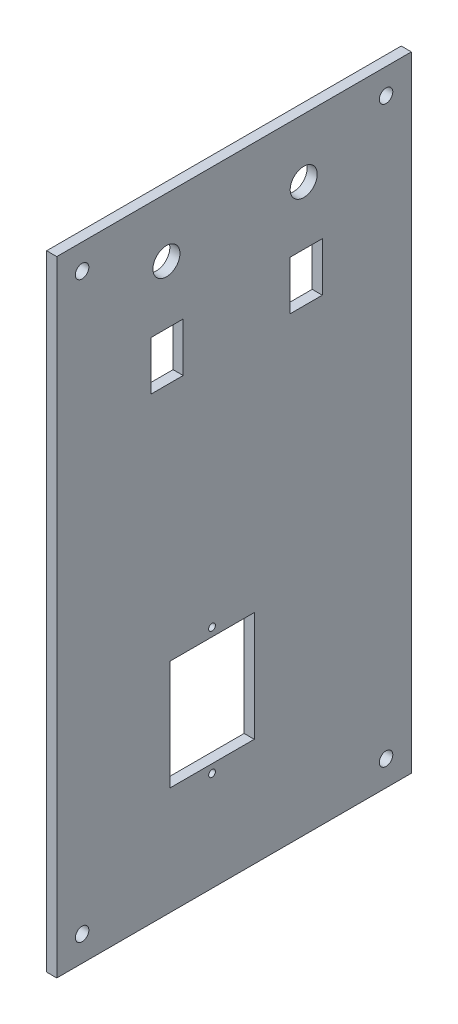
ISO-10303-21;
HEADER;
FILE_DESCRIPTION(('STEP AP214'),'2;1');
FILE_NAME('part.step','',(''),(''),'','','');
FILE_SCHEMA(('AUTOMOTIVE_DESIGN { 1 0 10303 214 1 1 1 1 }'));
ENDSEC;
DATA;
#1=APPLICATION_CONTEXT('core data for automotive mechanical design processes');
#2=APPLICATION_PROTOCOL_DEFINITION('international standard','automotive_design',2000,#1);
#3=PRODUCT_CONTEXT('',#1,'mechanical');
#4=PRODUCT('Part','Part','',(#3));
#5=PRODUCT_RELATED_PRODUCT_CATEGORY('part','',(#4));
#6=PRODUCT_DEFINITION_FORMATION('','',#4);
#7=PRODUCT_DEFINITION_CONTEXT('part definition',#1,'design');
#8=PRODUCT_DEFINITION('design','',#6,#7);
#9=PRODUCT_DEFINITION_SHAPE('','',#8);
#10=(LENGTH_UNIT() NAMED_UNIT(*) SI_UNIT(.MILLI.,.METRE.));
#11=(NAMED_UNIT(*) PLANE_ANGLE_UNIT() SI_UNIT($,.RADIAN.));
#12=(NAMED_UNIT(*) SI_UNIT($,.STERADIAN.) SOLID_ANGLE_UNIT());
#13=UNCERTAINTY_MEASURE_WITH_UNIT(LENGTH_MEASURE(1.E-05),#10,'distance_accuracy_value','');
#14=(GEOMETRIC_REPRESENTATION_CONTEXT(3) GLOBAL_UNCERTAINTY_ASSIGNED_CONTEXT((#13)) GLOBAL_UNIT_ASSIGNED_CONTEXT((#10,
#11,#12)) REPRESENTATION_CONTEXT('',''));
#15=CARTESIAN_POINT('',(0.,0.,0.));
#16=DIRECTION('',(0.,0.,1.));
#17=DIRECTION('',(1.,0.,0.));
#18=AXIS2_PLACEMENT_3D('',#15,#16,#17);
#19=CARTESIAN_POINT('',(6.,0.,0.));
#20=DIRECTION('',(0.,0.,-1.));
#21=DIRECTION('',(-1.,0.,0.));
#22=AXIS2_PLACEMENT_3D('',#19,#20,#21);
#23=PLANE('',#22);
#24=DIRECTION('',(0.,-1.,0.));
#25=VECTOR('',#24,1.);
#26=CARTESIAN_POINT('',(0.,0.,0.));
#27=LINE('',#26,#25);
#28=CARTESIAN_POINT('',(0.,370.,0.));
#29=VERTEX_POINT('',#28);
#30=CARTESIAN_POINT('',(0.,0.,0.));
#31=VERTEX_POINT('',#30);
#32=EDGE_CURVE('E249',#29,#31,#27,.T.);
#33=ORIENTED_EDGE('',*,*,#32,.T.);
#34=DIRECTION('',(-1.,0.,0.));
#35=VECTOR('',#34,1.);
#36=CARTESIAN_POINT('',(6.,0.,0.));
#37=LINE('',#36,#35);
#38=CARTESIAN_POINT('',(6.,0.,0.));
#39=VERTEX_POINT('',#38);
#40=EDGE_CURVE('E11',#39,#31,#37,.T.);
#41=ORIENTED_EDGE('',*,*,#40,.F.);
#42=DIRECTION('',(0.,-1.,0.));
#43=VECTOR('',#42,1.);
#44=CARTESIAN_POINT('',(6.,0.,0.));
#45=LINE('',#44,#43);
#46=CARTESIAN_POINT('',(6.,370.,0.));
#47=VERTEX_POINT('',#46);
#48=EDGE_CURVE('E250',#47,#39,#45,.T.);
#49=ORIENTED_EDGE('',*,*,#48,.F.);
#50=DIRECTION('',(-1.,0.,0.));
#51=VECTOR('',#50,1.);
#52=CARTESIAN_POINT('',(6.,370.,0.));
#53=LINE('',#52,#51);
#54=EDGE_CURVE('E260',#47,#29,#53,.T.);
#55=ORIENTED_EDGE('',*,*,#54,.T.);
#56=EDGE_LOOP('',(#33,#41,#49,#55));
#57=FACE_BOUND('',#56,.T.);
#58=ADVANCED_FACE('F32',(#57),#23,.F.);
#59=CARTESIAN_POINT('',(6.,0.,0.));
#60=DIRECTION('',(0.,1.,0.));
#61=DIRECTION('',(0.,0.,1.));
#62=AXIS2_PLACEMENT_3D('',#59,#60,#61);
#63=PLANE('',#62);
#64=DIRECTION('',(0.,0.,-1.));
#65=VECTOR('',#64,1.);
#66=CARTESIAN_POINT('',(0.,0.,0.));
#67=LINE('',#66,#65);
#68=CARTESIAN_POINT('',(0.,0.,-210.));
#69=VERTEX_POINT('',#68);
#70=EDGE_CURVE('E263',#31,#69,#67,.T.);
#71=ORIENTED_EDGE('',*,*,#70,.T.);
#72=DIRECTION('',(-1.,0.,0.));
#73=VECTOR('',#72,1.);
#74=CARTESIAN_POINT('',(6.,0.,-210.));
#75=LINE('',#74,#73);
#76=CARTESIAN_POINT('',(6.,0.,-210.));
#77=VERTEX_POINT('',#76);
#78=EDGE_CURVE('E40',#77,#69,#75,.T.);
#79=ORIENTED_EDGE('',*,*,#78,.F.);
#80=DIRECTION('',(0.,0.,-1.));
#81=VECTOR('',#80,1.);
#82=CARTESIAN_POINT('',(6.,0.,0.));
#83=LINE('',#82,#81);
#84=EDGE_CURVE('E253',#39,#77,#83,.T.);
#85=ORIENTED_EDGE('',*,*,#84,.F.);
#86=ORIENTED_EDGE('',*,*,#40,.T.);
#87=EDGE_LOOP('',(#71,#79,#85,#86));
#88=FACE_BOUND('',#87,.T.);
#89=ADVANCED_FACE('F341',(#88),#63,.F.);
#90=CARTESIAN_POINT('',(6.,0.,-210.));
#91=DIRECTION('',(0.,0.,1.));
#92=DIRECTION('',(1.,0.,0.));
#93=AXIS2_PLACEMENT_3D('',#90,#91,#92);
#94=PLANE('',#93);
#95=DIRECTION('',(0.,1.,0.));
#96=VECTOR('',#95,1.);
#97=CARTESIAN_POINT('',(0.,0.,-210.));
#98=LINE('',#97,#96);
#99=CARTESIAN_POINT('',(0.,370.,-210.));
#100=VERTEX_POINT('',#99);
#101=EDGE_CURVE('E265',#69,#100,#98,.T.);
#102=ORIENTED_EDGE('',*,*,#101,.T.);
#103=DIRECTION('',(-1.,0.,0.));
#104=VECTOR('',#103,1.);
#105=CARTESIAN_POINT('',(6.,370.,-210.));
#106=LINE('',#105,#104);
#107=CARTESIAN_POINT('',(6.,370.,-210.));
#108=VERTEX_POINT('',#107);
#109=EDGE_CURVE('E270',#108,#100,#106,.T.);
#110=ORIENTED_EDGE('',*,*,#109,.F.);
#111=DIRECTION('',(0.,1.,0.));
#112=VECTOR('',#111,1.);
#113=CARTESIAN_POINT('',(6.,0.,-210.));
#114=LINE('',#113,#112);
#115=EDGE_CURVE('E256',#77,#108,#114,.T.);
#116=ORIENTED_EDGE('',*,*,#115,.F.);
#117=ORIENTED_EDGE('',*,*,#78,.T.);
#118=EDGE_LOOP('',(#102,#110,#116,#117));
#119=FACE_BOUND('',#118,.T.);
#120=ADVANCED_FACE('F346',(#119),#94,.F.);
#121=CARTESIAN_POINT('',(6.,370.,0.));
#122=DIRECTION('',(0.,-1.,0.));
#123=DIRECTION('',(0.,0.,-1.));
#124=AXIS2_PLACEMENT_3D('',#121,#122,#123);
#125=PLANE('',#124);
#126=DIRECTION('',(0.,0.,1.));
#127=VECTOR('',#126,1.);
#128=CARTESIAN_POINT('',(0.,370.,0.));
#129=LINE('',#128,#127);
#130=EDGE_CURVE('E254',#100,#29,#129,.T.);
#131=ORIENTED_EDGE('',*,*,#130,.T.);
#132=ORIENTED_EDGE('',*,*,#54,.F.);
#133=DIRECTION('',(0.,0.,1.));
#134=VECTOR('',#133,1.);
#135=CARTESIAN_POINT('',(6.,370.,0.));
#136=LINE('',#135,#134);
#137=EDGE_CURVE('E258',#108,#47,#136,.T.);
#138=ORIENTED_EDGE('',*,*,#137,.F.);
#139=ORIENTED_EDGE('',*,*,#109,.T.);
#140=EDGE_LOOP('',(#131,#132,#138,#139));
#141=FACE_BOUND('',#140,.T.);
#142=ADVANCED_FACE('F328',(#141),#125,.F.);
#143=CARTESIAN_POINT('',(6.,0.,0.));
#144=DIRECTION('',(-1.,0.,0.));
#145=DIRECTION('',(0.,0.,1.));
#146=AXIS2_PLACEMENT_3D('',#143,#144,#145);
#147=PLANE('',#146);
#148=CARTESIAN_POINT('',(6.,355.052871545296,-15.0000931800799));
#149=DIRECTION('',(1.,0.,0.));
#150=DIRECTION('',(0.,0.,-1.));
#151=AXIS2_PLACEMENT_3D('',#148,#149,#150);
#152=CIRCLE('',#151,4.);
#153=CARTESIAN_POINT('',(6.,355.052871545296,-19.0000931800799));
#154=VERTEX_POINT('',#153);
#155=EDGE_CURVE('E291',#154,#154,#152,.T.);
#156=ORIENTED_EDGE('',*,*,#155,.F.);
#157=EDGE_LOOP('',(#156));
#158=FACE_BOUND('',#157,.T.);
#159=CARTESIAN_POINT('',(6.,354.999999999996,-195.000046590044));
#160=DIRECTION('',(1.,0.,0.));
#161=DIRECTION('',(0.,0.,-1.));
#162=AXIS2_PLACEMENT_3D('',#159,#160,#161);
#163=CIRCLE('',#162,3.99999999999999);
#164=CARTESIAN_POINT('',(6.,354.999999999996,-199.000046590044));
#165=VERTEX_POINT('',#164);
#166=EDGE_CURVE('E574',#165,#165,#163,.T.);
#167=ORIENTED_EDGE('',*,*,#166,.F.);
#168=EDGE_LOOP('',(#167));
#169=FACE_BOUND('',#168,.T.);
#170=CARTESIAN_POINT('',(6.,15.0176394205886,-195.000000000008));
#171=DIRECTION('',(1.,0.,0.));
#172=DIRECTION('',(0.,0.,-1.));
#173=AXIS2_PLACEMENT_3D('',#170,#171,#172);
#174=CIRCLE('',#173,3.99999999999999);
#175=CARTESIAN_POINT('',(6.,15.0176394205886,-199.000000000008));
#176=VERTEX_POINT('',#175);
#177=EDGE_CURVE('E304',#176,#176,#174,.T.);
#178=ORIENTED_EDGE('',*,*,#177,.F.);
#179=EDGE_LOOP('',(#178));
#180=FACE_BOUND('',#179,.T.);
#181=CARTESIAN_POINT('',(6.,15.1057430905918,-15.0000465900471));
#182=DIRECTION('',(1.,0.,0.));
#183=DIRECTION('',(0.,0.,-1.));
#184=AXIS2_PLACEMENT_3D('',#181,#182,#183);
#185=CIRCLE('',#184,4.);
#186=CARTESIAN_POINT('',(6.,15.1057430905918,-19.0000465900471));
#187=VERTEX_POINT('',#186);
#188=EDGE_CURVE('E287',#187,#187,#185,.T.);
#189=ORIENTED_EDGE('',*,*,#188,.F.);
#190=EDGE_LOOP('',(#189));
#191=FACE_BOUND('',#190,.T.);
#192=CARTESIAN_POINT('',(6.,335.160418708699,-64.9568234236906));
#193=DIRECTION('',(1.,0.,0.));
#194=DIRECTION('',(0.,0.,-1.));
#195=AXIS2_PLACEMENT_3D('',#192,#193,#194);
#196=CIRCLE('',#195,8.00000000002815);
#197=CARTESIAN_POINT('',(6.,335.160418708699,-72.9568234237188));
#198=VERTEX_POINT('',#197);
#199=EDGE_CURVE('E283',#198,#198,#196,.T.);
#200=ORIENTED_EDGE('',*,*,#199,.F.);
#201=EDGE_LOOP('',(#200));
#202=FACE_BOUND('',#201,.T.);
#203=CARTESIAN_POINT('',(6.,335.160418708701,-146.241614861531));
#204=DIRECTION('',(1.,0.,0.));
#205=DIRECTION('',(0.,0.,-1.));
#206=AXIS2_PLACEMENT_3D('',#203,#204,#205);
#207=CIRCLE('',#206,7.99999999999956);
#208=CARTESIAN_POINT('',(6.,335.160418708701,-154.24161486153));
#209=VERTEX_POINT('',#208);
#210=EDGE_CURVE('E279',#209,#209,#207,.T.);
#211=ORIENTED_EDGE('',*,*,#210,.F.);
#212=EDGE_LOOP('',(#211));
#213=FACE_BOUND('',#212,.T.);
#214=CARTESIAN_POINT('',(6.,58.9516158060169,-91.9554394391757));
#215=DIRECTION('',(-1.,0.,0.));
#216=DIRECTION('',(0.,0.,1.));
#217=AXIS2_PLACEMENT_3D('',#214,#215,#216);
#218=CIRCLE('',#217,1.99999999999186);
#219=CARTESIAN_POINT('',(6.,58.9516158060169,-89.9554394391839));
#220=VERTEX_POINT('',#219);
#221=EDGE_CURVE('E312',#220,#220,#218,.T.);
#222=ORIENTED_EDGE('',*,*,#221,.T.);
#223=EDGE_LOOP('',(#222));
#224=FACE_BOUND('',#223,.T.);
#225=CARTESIAN_POINT('',(6.,133.951615806017,-91.955439439176));
#226=DIRECTION('',(-1.,0.,0.));
#227=DIRECTION('',(0.,0.,1.));
#228=AXIS2_PLACEMENT_3D('',#225,#226,#227);
#229=CIRCLE('',#228,1.99999999999186);
#230=CARTESIAN_POINT('',(6.,133.951615806017,-89.9554394391841));
#231=VERTEX_POINT('',#230);
#232=EDGE_CURVE('E181',#231,#231,#229,.T.);
#233=ORIENTED_EDGE('',*,*,#232,.T.);
#234=EDGE_LOOP('',(#233));
#235=FACE_BOUND('',#234,.T.);
#236=DIRECTION('',(0.,0.,-1.));
#237=VECTOR('',#236,1.);
#238=CARTESIAN_POINT('',(6.,300.567321943193,0.));
#239=LINE('',#238,#237);
#240=CARTESIAN_POINT('',(6.,300.567321943193,-138.262028200826));
#241=VERTEX_POINT('',#240);
#242=CARTESIAN_POINT('',(6.,300.567321943193,-157.262028200826));
#243=VERTEX_POINT('',#242);
#244=EDGE_CURVE('E211',#241,#243,#239,.T.);
#245=ORIENTED_EDGE('',*,*,#244,.T.);
#246=DIRECTION('',(0.,-1.,0.));
#247=VECTOR('',#246,1.);
#248=CARTESIAN_POINT('',(6.,0.,-157.262028200826));
#249=LINE('',#248,#247);
#250=CARTESIAN_POINT('',(6.,271.567321943193,-157.262028200826));
#251=VERTEX_POINT('',#250);
#252=EDGE_CURVE('E214',#243,#251,#249,.T.);
#253=ORIENTED_EDGE('',*,*,#252,.T.);
#254=DIRECTION('',(0.,0.,1.));
#255=VECTOR('',#254,1.);
#256=CARTESIAN_POINT('',(6.,271.567321943193,0.));
#257=LINE('',#256,#255);
#258=CARTESIAN_POINT('',(6.,271.567321943193,-138.262028200826));
#259=VERTEX_POINT('',#258);
#260=EDGE_CURVE('E208',#251,#259,#257,.T.);
#261=ORIENTED_EDGE('',*,*,#260,.T.);
#262=DIRECTION('',(0.,1.,0.));
#263=VECTOR('',#262,1.);
#264=CARTESIAN_POINT('',(6.,0.,-138.262028200826));
#265=LINE('',#264,#263);
#266=EDGE_CURVE('E151',#259,#241,#265,.T.);
#267=ORIENTED_EDGE('',*,*,#266,.T.);
#268=EDGE_LOOP('',(#245,#253,#261,#267));
#269=FACE_BOUND('',#268,.T.);
#270=DIRECTION('',(0.,0.,-1.));
#271=VECTOR('',#270,1.);
#272=CARTESIAN_POINT('',(6.,300.567321943193,0.));
#273=LINE('',#272,#271);
#274=CARTESIAN_POINT('',(6.,300.567321943193,-55.8778644499005));
#275=VERTEX_POINT('',#274);
#276=CARTESIAN_POINT('',(6.,300.567321943193,-74.8778644499005));
#277=VERTEX_POINT('',#276);
#278=EDGE_CURVE('E202',#275,#277,#273,.T.);
#279=ORIENTED_EDGE('',*,*,#278,.T.);
#280=DIRECTION('',(0.,-1.,0.));
#281=VECTOR('',#280,1.);
#282=CARTESIAN_POINT('',(6.,0.,-74.8778644499005));
#283=LINE('',#282,#281);
#284=CARTESIAN_POINT('',(6.,271.567321943193,-74.8778644499005));
#285=VERTEX_POINT('',#284);
#286=EDGE_CURVE('E205',#277,#285,#283,.T.);
#287=ORIENTED_EDGE('',*,*,#286,.T.);
#288=DIRECTION('',(0.,0.,1.));
#289=VECTOR('',#288,1.);
#290=CARTESIAN_POINT('',(6.,271.567321943193,0.));
#291=LINE('',#290,#289);
#292=CARTESIAN_POINT('',(6.,271.567321943193,-55.8778644499005));
#293=VERTEX_POINT('',#292);
#294=EDGE_CURVE('E175',#285,#293,#291,.T.);
#295=ORIENTED_EDGE('',*,*,#294,.T.);
#296=DIRECTION('',(0.,1.,0.));
#297=VECTOR('',#296,1.);
#298=CARTESIAN_POINT('',(6.,0.,-55.8778644499005));
#299=LINE('',#298,#297);
#300=EDGE_CURVE('E199',#293,#275,#299,.T.);
#301=ORIENTED_EDGE('',*,*,#300,.T.);
#302=EDGE_LOOP('',(#279,#287,#295,#301));
#303=FACE_BOUND('',#302,.T.);
#304=DIRECTION('',(0.,0.,-1.));
#305=VECTOR('',#304,1.);
#306=CARTESIAN_POINT('',(6.,128.951615806017,0.));
#307=LINE('',#306,#305);
#308=CARTESIAN_POINT('',(6.,128.951615806017,-66.955439439176));
#309=VERTEX_POINT('',#308);
#310=CARTESIAN_POINT('',(6.,128.951615806017,-116.955439439176));
#311=VERTEX_POINT('',#310);
#312=EDGE_CURVE('E243',#309,#311,#307,.T.);
#313=ORIENTED_EDGE('',*,*,#312,.T.);
#314=DIRECTION('',(0.,-1.,0.));
#315=VECTOR('',#314,1.);
#316=CARTESIAN_POINT('',(6.,0.,-116.955439439176));
#317=LINE('',#316,#315);
#318=CARTESIAN_POINT('',(6.,63.9516158060169,-116.955439439176));
#319=VERTEX_POINT('',#318);
#320=EDGE_CURVE('E246',#311,#319,#317,.T.);
#321=ORIENTED_EDGE('',*,*,#320,.T.);
#322=DIRECTION('',(0.,0.,1.));
#323=VECTOR('',#322,1.);
#324=CARTESIAN_POINT('',(6.,63.9516158060169,0.));
#325=LINE('',#324,#323);
#326=CARTESIAN_POINT('',(6.,63.9516158060169,-66.955439439176));
#327=VERTEX_POINT('',#326);
#328=EDGE_CURVE('E231',#319,#327,#325,.T.);
#329=ORIENTED_EDGE('',*,*,#328,.T.);
#330=DIRECTION('',(0.,1.,0.));
#331=VECTOR('',#330,1.);
#332=CARTESIAN_POINT('',(6.,0.,-66.955439439176));
#333=LINE('',#332,#331);
#334=EDGE_CURVE('E240',#327,#309,#333,.T.);
#335=ORIENTED_EDGE('',*,*,#334,.T.);
#336=EDGE_LOOP('',(#313,#321,#329,#335));
#337=FACE_BOUND('',#336,.T.);
#338=ORIENTED_EDGE('',*,*,#48,.T.);
#339=ORIENTED_EDGE('',*,*,#84,.T.);
#340=ORIENTED_EDGE('',*,*,#115,.T.);
#341=ORIENTED_EDGE('',*,*,#137,.T.);
#342=EDGE_LOOP('',(#338,#339,#340,#341));
#343=FACE_BOUND('',#342,.T.);
#344=ADVANCED_FACE('F325',(#158,#169,#180,#191,#202,#213,#224,#235,#269,#303,#337,#343),#147,.F.);
#345=CARTESIAN_POINT('',(0.,0.,0.));
#346=DIRECTION('',(-1.,0.,0.));
#347=DIRECTION('',(0.,0.,1.));
#348=AXIS2_PLACEMENT_3D('',#345,#346,#347);
#349=PLANE('',#348);
#350=CARTESIAN_POINT('',(0.,355.052871545296,-15.0000931800799));
#351=DIRECTION('',(-1.,0.,0.));
#352=DIRECTION('',(0.,0.,1.));
#353=AXIS2_PLACEMENT_3D('',#350,#351,#352);
#354=CIRCLE('',#353,4.);
#355=CARTESIAN_POINT('',(0.,355.052871545296,-11.0000931800799));
#356=VERTEX_POINT('',#355);
#357=EDGE_CURVE('E35',#356,#356,#354,.T.);
#358=ORIENTED_EDGE('',*,*,#357,.F.);
#359=EDGE_LOOP('',(#358));
#360=FACE_BOUND('',#359,.T.);
#361=CARTESIAN_POINT('',(0.,354.999999999996,-195.000046590044));
#362=DIRECTION('',(-1.,0.,0.));
#363=DIRECTION('',(0.,0.,1.));
#364=AXIS2_PLACEMENT_3D('',#361,#362,#363);
#365=CIRCLE('',#364,3.99999999999999);
#366=CARTESIAN_POINT('',(0.,354.999999999996,-191.000046590044));
#367=VERTEX_POINT('',#366);
#368=EDGE_CURVE('E290',#367,#367,#365,.T.);
#369=ORIENTED_EDGE('',*,*,#368,.F.);
#370=EDGE_LOOP('',(#369));
#371=FACE_BOUND('',#370,.T.);
#372=CARTESIAN_POINT('',(0.,15.0176394205886,-195.000000000008));
#373=DIRECTION('',(-1.,0.,0.));
#374=DIRECTION('',(0.,0.,1.));
#375=AXIS2_PLACEMENT_3D('',#372,#373,#374);
#376=CIRCLE('',#375,3.99999999999999);
#377=CARTESIAN_POINT('',(0.,15.0176394205886,-191.000000000008));
#378=VERTEX_POINT('',#377);
#379=EDGE_CURVE('E288',#378,#378,#376,.T.);
#380=ORIENTED_EDGE('',*,*,#379,.F.);
#381=EDGE_LOOP('',(#380));
#382=FACE_BOUND('',#381,.T.);
#383=CARTESIAN_POINT('',(0.,15.1057430905918,-15.0000465900471));
#384=DIRECTION('',(-1.,0.,0.));
#385=DIRECTION('',(0.,0.,1.));
#386=AXIS2_PLACEMENT_3D('',#383,#384,#385);
#387=CIRCLE('',#386,4.);
#388=CARTESIAN_POINT('',(0.,15.1057430905918,-11.0000465900471));
#389=VERTEX_POINT('',#388);
#390=EDGE_CURVE('E284',#389,#389,#387,.T.);
#391=ORIENTED_EDGE('',*,*,#390,.F.);
#392=EDGE_LOOP('',(#391));
#393=FACE_BOUND('',#392,.T.);
#394=CARTESIAN_POINT('',(0.,335.160418708699,-64.9568234236906));
#395=DIRECTION('',(-1.,0.,0.));
#396=DIRECTION('',(0.,0.,1.));
#397=AXIS2_PLACEMENT_3D('',#394,#395,#396);
#398=CIRCLE('',#397,8.00000000002815);
#399=CARTESIAN_POINT('',(0.,335.160418708699,-56.9568234236625));
#400=VERTEX_POINT('',#399);
#401=EDGE_CURVE('E280',#400,#400,#398,.T.);
#402=ORIENTED_EDGE('',*,*,#401,.F.);
#403=EDGE_LOOP('',(#402));
#404=FACE_BOUND('',#403,.T.);
#405=CARTESIAN_POINT('',(0.,335.160418708701,-146.241614861531));
#406=DIRECTION('',(-1.,0.,0.));
#407=DIRECTION('',(0.,0.,1.));
#408=AXIS2_PLACEMENT_3D('',#405,#406,#407);
#409=CIRCLE('',#408,7.99999999999956);
#410=CARTESIAN_POINT('',(0.,335.160418708701,-138.241614861531));
#411=VERTEX_POINT('',#410);
#412=EDGE_CURVE('E275',#411,#411,#409,.T.);
#413=ORIENTED_EDGE('',*,*,#412,.F.);
#414=EDGE_LOOP('',(#413));
#415=FACE_BOUND('',#414,.T.);
#416=CARTESIAN_POINT('',(0.,58.9516158060169,-91.9554394391757));
#417=DIRECTION('',(-1.,0.,0.));
#418=DIRECTION('',(0.,0.,1.));
#419=AXIS2_PLACEMENT_3D('',#416,#417,#418);
#420=CIRCLE('',#419,1.99999999999186);
#421=CARTESIAN_POINT('',(0.,58.9516158060169,-89.9554394391839));
#422=VERTEX_POINT('',#421);
#423=EDGE_CURVE('E278',#422,#422,#420,.T.);
#424=ORIENTED_EDGE('',*,*,#423,.F.);
#425=EDGE_LOOP('',(#424));
#426=FACE_BOUND('',#425,.T.);
#427=CARTESIAN_POINT('',(0.,133.951615806017,-91.955439439176));
#428=DIRECTION('',(-1.,0.,0.));
#429=DIRECTION('',(0.,0.,1.));
#430=AXIS2_PLACEMENT_3D('',#427,#428,#429);
#431=CIRCLE('',#430,1.99999999999186);
#432=CARTESIAN_POINT('',(0.,133.951615806017,-89.9554394391841));
#433=VERTEX_POINT('',#432);
#434=EDGE_CURVE('E315',#433,#433,#431,.T.);
#435=ORIENTED_EDGE('',*,*,#434,.F.);
#436=EDGE_LOOP('',(#435));
#437=FACE_BOUND('',#436,.T.);
#438=DIRECTION('',(0.,-1.,0.));
#439=VECTOR('',#438,1.);
#440=CARTESIAN_POINT('',(0.,271.567321943193,-157.262028200826));
#441=LINE('',#440,#439);
#442=CARTESIAN_POINT('',(0.,300.567321943193,-157.262028200826));
#443=VERTEX_POINT('',#442);
#444=CARTESIAN_POINT('',(0.,271.567321943193,-157.262028200826));
#445=VERTEX_POINT('',#444);
#446=EDGE_CURVE('E163',#443,#445,#441,.T.);
#447=ORIENTED_EDGE('',*,*,#446,.F.);
#448=DIRECTION('',(0.,0.,-1.));
#449=VECTOR('',#448,1.);
#450=CARTESIAN_POINT('',(0.,300.567321943193,-157.262028200826));
#451=LINE('',#450,#449);
#452=CARTESIAN_POINT('',(0.,300.567321943193,-138.262028200826));
#453=VERTEX_POINT('',#452);
#454=EDGE_CURVE('E168',#453,#443,#451,.T.);
#455=ORIENTED_EDGE('',*,*,#454,.F.);
#456=DIRECTION('',(0.,1.,0.));
#457=VECTOR('',#456,1.);
#458=CARTESIAN_POINT('',(0.,271.567321943193,-138.262028200826));
#459=LINE('',#458,#457);
#460=CARTESIAN_POINT('',(0.,271.567321943193,-138.262028200826));
#461=VERTEX_POINT('',#460);
#462=EDGE_CURVE('E148',#461,#453,#459,.T.);
#463=ORIENTED_EDGE('',*,*,#462,.F.);
#464=DIRECTION('',(0.,0.,1.));
#465=VECTOR('',#464,1.);
#466=CARTESIAN_POINT('',(0.,271.567321943193,-157.262028200826));
#467=LINE('',#466,#465);
#468=EDGE_CURVE('E158',#445,#461,#467,.T.);
#469=ORIENTED_EDGE('',*,*,#468,.F.);
#470=EDGE_LOOP('',(#447,#455,#463,#469));
#471=FACE_BOUND('',#470,.T.);
#472=DIRECTION('',(0.,-1.,0.));
#473=VECTOR('',#472,1.);
#474=CARTESIAN_POINT('',(0.,271.567321943193,-74.8778644499005));
#475=LINE('',#474,#473);
#476=CARTESIAN_POINT('',(0.,300.567321943193,-74.8778644499005));
#477=VERTEX_POINT('',#476);
#478=CARTESIAN_POINT('',(0.,271.567321943193,-74.8778644499005));
#479=VERTEX_POINT('',#478);
#480=EDGE_CURVE('E178',#477,#479,#475,.T.);
#481=ORIENTED_EDGE('',*,*,#480,.F.);
#482=DIRECTION('',(0.,0.,-1.));
#483=VECTOR('',#482,1.);
#484=CARTESIAN_POINT('',(0.,300.567321943193,-74.8778644499005));
#485=LINE('',#484,#483);
#486=CARTESIAN_POINT('',(0.,300.567321943193,-55.8778644499005));
#487=VERTEX_POINT('',#486);
#488=EDGE_CURVE('E186',#487,#477,#485,.T.);
#489=ORIENTED_EDGE('',*,*,#488,.F.);
#490=DIRECTION('',(0.,1.,0.));
#491=VECTOR('',#490,1.);
#492=CARTESIAN_POINT('',(0.,271.567321943193,-55.8778644499005));
#493=LINE('',#492,#491);
#494=CARTESIAN_POINT('',(0.,271.567321943193,-55.8778644499005));
#495=VERTEX_POINT('',#494);
#496=EDGE_CURVE('E183',#495,#487,#493,.T.);
#497=ORIENTED_EDGE('',*,*,#496,.F.);
#498=DIRECTION('',(0.,0.,1.));
#499=VECTOR('',#498,1.);
#500=CARTESIAN_POINT('',(0.,271.567321943193,-74.8778644499005));
#501=LINE('',#500,#499);
#502=EDGE_CURVE('E180',#479,#495,#501,.T.);
#503=ORIENTED_EDGE('',*,*,#502,.F.);
#504=EDGE_LOOP('',(#481,#489,#497,#503));
#505=FACE_BOUND('',#504,.T.);
#506=DIRECTION('',(0.,-1.,0.));
#507=VECTOR('',#506,1.);
#508=CARTESIAN_POINT('',(0.,63.9516158060169,-116.955439439176));
#509=LINE('',#508,#507);
#510=CARTESIAN_POINT('',(0.,128.951615806017,-116.955439439176));
#511=VERTEX_POINT('',#510);
#512=CARTESIAN_POINT('',(0.,63.9516158060169,-116.955439439176));
#513=VERTEX_POINT('',#512);
#514=EDGE_CURVE('E217',#511,#513,#509,.T.);
#515=ORIENTED_EDGE('',*,*,#514,.F.);
#516=DIRECTION('',(0.,0.,-1.));
#517=VECTOR('',#516,1.);
#518=CARTESIAN_POINT('',(0.,128.951615806017,-116.955439439176));
#519=LINE('',#518,#517);
#520=CARTESIAN_POINT('',(0.,128.951615806017,-66.955439439176));
#521=VERTEX_POINT('',#520);
#522=EDGE_CURVE('E225',#521,#511,#519,.T.);
#523=ORIENTED_EDGE('',*,*,#522,.F.);
#524=DIRECTION('',(0.,1.,0.));
#525=VECTOR('',#524,1.);
#526=CARTESIAN_POINT('',(0.,63.9516158060169,-66.955439439176));
#527=LINE('',#526,#525);
#528=CARTESIAN_POINT('',(0.,63.9516158060169,-66.955439439176));
#529=VERTEX_POINT('',#528);
#530=EDGE_CURVE('E222',#529,#521,#527,.T.);
#531=ORIENTED_EDGE('',*,*,#530,.F.);
#532=DIRECTION('',(0.,0.,1.));
#533=VECTOR('',#532,1.);
#534=CARTESIAN_POINT('',(0.,63.9516158060169,-116.955439439176));
#535=LINE('',#534,#533);
#536=EDGE_CURVE('E219',#513,#529,#535,.T.);
#537=ORIENTED_EDGE('',*,*,#536,.F.);
#538=EDGE_LOOP('',(#515,#523,#531,#537));
#539=FACE_BOUND('',#538,.T.);
#540=ORIENTED_EDGE('',*,*,#32,.F.);
#541=ORIENTED_EDGE('',*,*,#130,.F.);
#542=ORIENTED_EDGE('',*,*,#101,.F.);
#543=ORIENTED_EDGE('',*,*,#70,.F.);
#544=EDGE_LOOP('',(#540,#541,#542,#543));
#545=FACE_BOUND('',#544,.T.);
#546=ADVANCED_FACE('F165',(#360,#371,#382,#393,#404,#415,#426,#437,#471,#505,#539,#545),#349,.T.);
#547=CARTESIAN_POINT('',(10.,63.9516158060169,-116.955439439176));
#548=DIRECTION('',(0.,0.,-1.));
#549=DIRECTION('',(-1.,0.,0.));
#550=AXIS2_PLACEMENT_3D('',#547,#548,#549);
#551=PLANE('',#550);
#552=DIRECTION('',(-1.,0.,0.));
#553=VECTOR('',#552,1.);
#554=CARTESIAN_POINT('',(10.,128.951615806017,-116.955439439176));
#555=LINE('',#554,#553);
#556=EDGE_CURVE('E229',#311,#511,#555,.T.);
#557=ORIENTED_EDGE('',*,*,#556,.T.);
#558=ORIENTED_EDGE('',*,*,#514,.T.);
#559=DIRECTION('',(-1.,0.,0.));
#560=VECTOR('',#559,1.);
#561=CARTESIAN_POINT('',(10.,63.9516158060169,-116.955439439176));
#562=LINE('',#561,#560);
#563=EDGE_CURVE('E228',#319,#513,#562,.T.);
#564=ORIENTED_EDGE('',*,*,#563,.F.);
#565=ORIENTED_EDGE('',*,*,#320,.F.);
#566=EDGE_LOOP('',(#557,#558,#564,#565));
#567=FACE_BOUND('',#566,.T.);
#568=ADVANCED_FACE('F351',(#567),#551,.F.);
#569=CARTESIAN_POINT('',(10.,128.951615806017,-116.955439439176));
#570=DIRECTION('',(0.,1.,0.));
#571=DIRECTION('',(0.,0.,1.));
#572=AXIS2_PLACEMENT_3D('',#569,#570,#571);
#573=PLANE('',#572);
#574=DIRECTION('',(-1.,0.,0.));
#575=VECTOR('',#574,1.);
#576=CARTESIAN_POINT('',(10.,128.951615806017,-66.955439439176));
#577=LINE('',#576,#575);
#578=EDGE_CURVE('E232',#309,#521,#577,.T.);
#579=ORIENTED_EDGE('',*,*,#578,.T.);
#580=ORIENTED_EDGE('',*,*,#522,.T.);
#581=ORIENTED_EDGE('',*,*,#556,.F.);
#582=ORIENTED_EDGE('',*,*,#312,.F.);
#583=EDGE_LOOP('',(#579,#580,#581,#582));
#584=FACE_BOUND('',#583,.T.);
#585=ADVANCED_FACE('F358',(#584),#573,.F.);
#586=CARTESIAN_POINT('',(10.,63.9516158060169,-66.955439439176));
#587=DIRECTION('',(0.,0.,1.));
#588=DIRECTION('',(1.,0.,0.));
#589=AXIS2_PLACEMENT_3D('',#586,#587,#588);
#590=PLANE('',#589);
#591=DIRECTION('',(-1.,0.,0.));
#592=VECTOR('',#591,1.);
#593=CARTESIAN_POINT('',(10.,63.9516158060169,-66.955439439176));
#594=LINE('',#593,#592);
#595=EDGE_CURVE('E234',#327,#529,#594,.T.);
#596=ORIENTED_EDGE('',*,*,#595,.T.);
#597=ORIENTED_EDGE('',*,*,#530,.T.);
#598=ORIENTED_EDGE('',*,*,#578,.F.);
#599=ORIENTED_EDGE('',*,*,#334,.F.);
#600=EDGE_LOOP('',(#596,#597,#598,#599));
#601=FACE_BOUND('',#600,.T.);
#602=ADVANCED_FACE('F397',(#601),#590,.F.);
#603=CARTESIAN_POINT('',(10.,63.9516158060169,-116.955439439176));
#604=DIRECTION('',(0.,-1.,0.));
#605=DIRECTION('',(0.,0.,-1.));
#606=AXIS2_PLACEMENT_3D('',#603,#604,#605);
#607=PLANE('',#606);
#608=ORIENTED_EDGE('',*,*,#563,.T.);
#609=ORIENTED_EDGE('',*,*,#536,.T.);
#610=ORIENTED_EDGE('',*,*,#595,.F.);
#611=ORIENTED_EDGE('',*,*,#328,.F.);
#612=EDGE_LOOP('',(#608,#609,#610,#611));
#613=FACE_BOUND('',#612,.T.);
#614=ADVANCED_FACE('F405',(#613),#607,.F.);
#615=CARTESIAN_POINT('',(10.,271.567321943193,-74.8778644499005));
#616=DIRECTION('',(0.,0.,-1.));
#617=DIRECTION('',(-1.,0.,0.));
#618=AXIS2_PLACEMENT_3D('',#615,#616,#617);
#619=PLANE('',#618);
#620=DIRECTION('',(-1.,0.,0.));
#621=VECTOR('',#620,1.);
#622=CARTESIAN_POINT('',(10.,300.567321943193,-74.8778644499005));
#623=LINE('',#622,#621);
#624=EDGE_CURVE('E190',#277,#477,#623,.T.);
#625=ORIENTED_EDGE('',*,*,#624,.T.);
#626=ORIENTED_EDGE('',*,*,#480,.T.);
#627=DIRECTION('',(-1.,0.,0.));
#628=VECTOR('',#627,1.);
#629=CARTESIAN_POINT('',(10.,271.567321943193,-74.8778644499005));
#630=LINE('',#629,#628);
#631=EDGE_CURVE('E189',#285,#479,#630,.T.);
#632=ORIENTED_EDGE('',*,*,#631,.F.);
#633=ORIENTED_EDGE('',*,*,#286,.F.);
#634=EDGE_LOOP('',(#625,#626,#632,#633));
#635=FACE_BOUND('',#634,.T.);
#636=ADVANCED_FACE('F413',(#635),#619,.F.);
#637=CARTESIAN_POINT('',(10.,300.567321943193,-74.8778644499005));
#638=DIRECTION('',(0.,1.,0.));
#639=DIRECTION('',(0.,0.,1.));
#640=AXIS2_PLACEMENT_3D('',#637,#638,#639);
#641=PLANE('',#640);
#642=DIRECTION('',(-1.,0.,0.));
#643=VECTOR('',#642,1.);
#644=CARTESIAN_POINT('',(10.,300.567321943193,-55.8778644499005));
#645=LINE('',#644,#643);
#646=EDGE_CURVE('E192',#275,#487,#645,.T.);
#647=ORIENTED_EDGE('',*,*,#646,.T.);
#648=ORIENTED_EDGE('',*,*,#488,.T.);
#649=ORIENTED_EDGE('',*,*,#624,.F.);
#650=ORIENTED_EDGE('',*,*,#278,.F.);
#651=EDGE_LOOP('',(#647,#648,#649,#650));
#652=FACE_BOUND('',#651,.T.);
#653=ADVANCED_FACE('F421',(#652),#641,.F.);
#654=CARTESIAN_POINT('',(10.,271.567321943193,-55.8778644499005));
#655=DIRECTION('',(0.,0.,1.));
#656=DIRECTION('',(1.,0.,0.));
#657=AXIS2_PLACEMENT_3D('',#654,#655,#656);
#658=PLANE('',#657);
#659=DIRECTION('',(-1.,0.,0.));
#660=VECTOR('',#659,1.);
#661=CARTESIAN_POINT('',(10.,271.567321943193,-55.8778644499005));
#662=LINE('',#661,#660);
#663=EDGE_CURVE('E56',#293,#495,#662,.T.);
#664=ORIENTED_EDGE('',*,*,#663,.T.);
#665=ORIENTED_EDGE('',*,*,#496,.T.);
#666=ORIENTED_EDGE('',*,*,#646,.F.);
#667=ORIENTED_EDGE('',*,*,#300,.F.);
#668=EDGE_LOOP('',(#664,#665,#666,#667));
#669=FACE_BOUND('',#668,.T.);
#670=ADVANCED_FACE('F429',(#669),#658,.F.);
#671=CARTESIAN_POINT('',(10.,271.567321943193,-74.8778644499005));
#672=DIRECTION('',(0.,-1.,0.));
#673=DIRECTION('',(0.,0.,-1.));
#674=AXIS2_PLACEMENT_3D('',#671,#672,#673);
#675=PLANE('',#674);
#676=ORIENTED_EDGE('',*,*,#631,.T.);
#677=ORIENTED_EDGE('',*,*,#502,.T.);
#678=ORIENTED_EDGE('',*,*,#663,.F.);
#679=ORIENTED_EDGE('',*,*,#294,.F.);
#680=EDGE_LOOP('',(#676,#677,#678,#679));
#681=FACE_BOUND('',#680,.T.);
#682=ADVANCED_FACE('F437',(#681),#675,.F.);
#683=CARTESIAN_POINT('',(10.,271.567321943193,-157.262028200826));
#684=DIRECTION('',(0.,0.,-1.));
#685=DIRECTION('',(-1.,0.,0.));
#686=AXIS2_PLACEMENT_3D('',#683,#684,#685);
#687=PLANE('',#686);
#688=DIRECTION('',(-1.,0.,0.));
#689=VECTOR('',#688,1.);
#690=CARTESIAN_POINT('',(10.,300.567321943193,-157.262028200826));
#691=LINE('',#690,#689);
#692=EDGE_CURVE('E173',#243,#443,#691,.T.);
#693=ORIENTED_EDGE('',*,*,#692,.T.);
#694=ORIENTED_EDGE('',*,*,#446,.T.);
#695=DIRECTION('',(-1.,0.,0.));
#696=VECTOR('',#695,1.);
#697=CARTESIAN_POINT('',(10.,271.567321943193,-157.262028200826));
#698=LINE('',#697,#696);
#699=EDGE_CURVE('E154',#251,#445,#698,.T.);
#700=ORIENTED_EDGE('',*,*,#699,.F.);
#701=ORIENTED_EDGE('',*,*,#252,.F.);
#702=EDGE_LOOP('',(#693,#694,#700,#701));
#703=FACE_BOUND('',#702,.T.);
#704=ADVANCED_FACE('F320',(#703),#687,.F.);
#705=CARTESIAN_POINT('',(10.,300.567321943193,-157.262028200826));
#706=DIRECTION('',(0.,1.,0.));
#707=DIRECTION('',(0.,0.,1.));
#708=AXIS2_PLACEMENT_3D('',#705,#706,#707);
#709=PLANE('',#708);
#710=DIRECTION('',(-1.,0.,0.));
#711=VECTOR('',#710,1.);
#712=CARTESIAN_POINT('',(10.,300.567321943193,-138.262028200826));
#713=LINE('',#712,#711);
#714=EDGE_CURVE('E153',#241,#453,#713,.T.);
#715=ORIENTED_EDGE('',*,*,#714,.T.);
#716=ORIENTED_EDGE('',*,*,#454,.T.);
#717=ORIENTED_EDGE('',*,*,#692,.F.);
#718=ORIENTED_EDGE('',*,*,#244,.F.);
#719=EDGE_LOOP('',(#715,#716,#717,#718));
#720=FACE_BOUND('',#719,.T.);
#721=ADVANCED_FACE('F323',(#720),#709,.F.);
#722=CARTESIAN_POINT('',(10.,271.567321943193,-138.262028200826));
#723=DIRECTION('',(0.,0.,1.));
#724=DIRECTION('',(1.,0.,0.));
#725=AXIS2_PLACEMENT_3D('',#722,#723,#724);
#726=PLANE('',#725);
#727=DIRECTION('',(-1.,0.,0.));
#728=VECTOR('',#727,1.);
#729=CARTESIAN_POINT('',(10.,271.567321943193,-138.262028200826));
#730=LINE('',#729,#728);
#731=EDGE_CURVE('E48',#259,#461,#730,.T.);
#732=ORIENTED_EDGE('',*,*,#731,.T.);
#733=ORIENTED_EDGE('',*,*,#462,.T.);
#734=ORIENTED_EDGE('',*,*,#714,.F.);
#735=ORIENTED_EDGE('',*,*,#266,.F.);
#736=EDGE_LOOP('',(#732,#733,#734,#735));
#737=FACE_BOUND('',#736,.T.);
#738=ADVANCED_FACE('F145',(#737),#726,.F.);
#739=CARTESIAN_POINT('',(10.,271.567321943193,-157.262028200826));
#740=DIRECTION('',(0.,-1.,0.));
#741=DIRECTION('',(0.,0.,-1.));
#742=AXIS2_PLACEMENT_3D('',#739,#740,#741);
#743=PLANE('',#742);
#744=ORIENTED_EDGE('',*,*,#699,.T.);
#745=ORIENTED_EDGE('',*,*,#468,.T.);
#746=ORIENTED_EDGE('',*,*,#731,.F.);
#747=ORIENTED_EDGE('',*,*,#260,.F.);
#748=EDGE_LOOP('',(#744,#745,#746,#747));
#749=FACE_BOUND('',#748,.T.);
#750=ADVANCED_FACE('F159',(#749),#743,.F.);
#751=CARTESIAN_POINT('',(10.,133.951615806017,-91.955439439176));
#752=DIRECTION('',(-1.,0.,0.));
#753=DIRECTION('',(0.,0.,1.));
#754=AXIS2_PLACEMENT_3D('',#751,#752,#753);
#755=CYLINDRICAL_SURFACE('',#754,1.99999999999186);
#756=ORIENTED_EDGE('',*,*,#434,.T.);
#757=EDGE_LOOP('',(#756));
#758=FACE_BOUND('',#757,.T.);
#759=ORIENTED_EDGE('',*,*,#232,.F.);
#760=EDGE_LOOP('',(#759));
#761=FACE_BOUND('',#760,.T.);
#762=ADVANCED_FACE('F469',(#758,#761),#755,.F.);
#763=CARTESIAN_POINT('',(10.,58.9516158060169,-91.9554394391757));
#764=DIRECTION('',(-1.,0.,0.));
#765=DIRECTION('',(0.,0.,1.));
#766=AXIS2_PLACEMENT_3D('',#763,#764,#765);
#767=CYLINDRICAL_SURFACE('',#766,1.99999999999186);
#768=ORIENTED_EDGE('',*,*,#423,.T.);
#769=EDGE_LOOP('',(#768));
#770=FACE_BOUND('',#769,.T.);
#771=ORIENTED_EDGE('',*,*,#221,.F.);
#772=EDGE_LOOP('',(#771));
#773=FACE_BOUND('',#772,.T.);
#774=ADVANCED_FACE('F476',(#770,#773),#767,.F.);
#775=CARTESIAN_POINT('',(-4.,335.160418708701,-146.241614861531));
#776=DIRECTION('',(1.,0.,0.));
#777=DIRECTION('',(0.,0.,-1.));
#778=AXIS2_PLACEMENT_3D('',#775,#776,#777);
#779=CYLINDRICAL_SURFACE('',#778,7.99999999999956);
#780=ORIENTED_EDGE('',*,*,#412,.T.);
#781=EDGE_LOOP('',(#780));
#782=FACE_BOUND('',#781,.T.);
#783=ORIENTED_EDGE('',*,*,#210,.T.);
#784=EDGE_LOOP('',(#783));
#785=FACE_BOUND('',#784,.T.);
#786=ADVANCED_FACE('F484',(#782,#785),#779,.F.);
#787=CARTESIAN_POINT('',(-4.,335.160418708699,-64.9568234236906));
#788=DIRECTION('',(1.,0.,0.));
#789=DIRECTION('',(0.,0.,-1.));
#790=AXIS2_PLACEMENT_3D('',#787,#788,#789);
#791=CYLINDRICAL_SURFACE('',#790,8.00000000002815);
#792=ORIENTED_EDGE('',*,*,#401,.T.);
#793=EDGE_LOOP('',(#792));
#794=FACE_BOUND('',#793,.T.);
#795=ORIENTED_EDGE('',*,*,#199,.T.);
#796=EDGE_LOOP('',(#795));
#797=FACE_BOUND('',#796,.T.);
#798=ADVANCED_FACE('F492',(#794,#797),#791,.F.);
#799=CARTESIAN_POINT('',(-6.,15.1057430905918,-15.0000465900471));
#800=DIRECTION('',(1.,0.,0.));
#801=DIRECTION('',(0.,0.,-1.));
#802=AXIS2_PLACEMENT_3D('',#799,#800,#801);
#803=CYLINDRICAL_SURFACE('',#802,4.);
#804=ORIENTED_EDGE('',*,*,#390,.T.);
#805=EDGE_LOOP('',(#804));
#806=FACE_BOUND('',#805,.T.);
#807=ORIENTED_EDGE('',*,*,#188,.T.);
#808=EDGE_LOOP('',(#807));
#809=FACE_BOUND('',#808,.T.);
#810=ADVANCED_FACE('F499',(#806,#809),#803,.F.);
#811=CARTESIAN_POINT('',(-6.,15.0176394205886,-195.000000000008));
#812=DIRECTION('',(1.,0.,0.));
#813=DIRECTION('',(0.,0.,-1.));
#814=AXIS2_PLACEMENT_3D('',#811,#812,#813);
#815=CYLINDRICAL_SURFACE('',#814,3.99999999999999);
#816=ORIENTED_EDGE('',*,*,#379,.T.);
#817=EDGE_LOOP('',(#816));
#818=FACE_BOUND('',#817,.T.);
#819=ORIENTED_EDGE('',*,*,#177,.T.);
#820=EDGE_LOOP('',(#819));
#821=FACE_BOUND('',#820,.T.);
#822=ADVANCED_FACE('F506',(#818,#821),#815,.F.);
#823=CARTESIAN_POINT('',(-6.,354.999999999996,-195.000046590044));
#824=DIRECTION('',(1.,0.,0.));
#825=DIRECTION('',(0.,0.,-1.));
#826=AXIS2_PLACEMENT_3D('',#823,#824,#825);
#827=CYLINDRICAL_SURFACE('',#826,3.99999999999999);
#828=ORIENTED_EDGE('',*,*,#368,.T.);
#829=EDGE_LOOP('',(#828));
#830=FACE_BOUND('',#829,.T.);
#831=ORIENTED_EDGE('',*,*,#166,.T.);
#832=EDGE_LOOP('',(#831));
#833=FACE_BOUND('',#832,.T.);
#834=ADVANCED_FACE('F514',(#830,#833),#827,.F.);
#835=CARTESIAN_POINT('',(-6.,355.052871545296,-15.0000931800799));
#836=DIRECTION('',(1.,0.,0.));
#837=DIRECTION('',(0.,0.,-1.));
#838=AXIS2_PLACEMENT_3D('',#835,#836,#837);
#839=CYLINDRICAL_SURFACE('',#838,4.);
#840=ORIENTED_EDGE('',*,*,#357,.T.);
#841=EDGE_LOOP('',(#840));
#842=FACE_BOUND('',#841,.T.);
#843=ORIENTED_EDGE('',*,*,#155,.T.);
#844=EDGE_LOOP('',(#843));
#845=FACE_BOUND('',#844,.T.);
#846=ADVANCED_FACE('F522',(#842,#845),#839,.F.);
#847=CLOSED_SHELL('',(#58,#89,#120,#142,#344,#546,#568,#585,#602,#614,#636,#653,#670,#682,#704,
#721,#738,#750,#762,#774,#786,#798,#810,#822,#834,#846));
#848=MANIFOLD_SOLID_BREP('B2',#847);
#849=ADVANCED_BREP_SHAPE_REPRESENTATION('',(#18,#848),#14);
#850=SHAPE_DEFINITION_REPRESENTATION(#9,#849);
ENDSEC;
END-ISO-10303-21;
